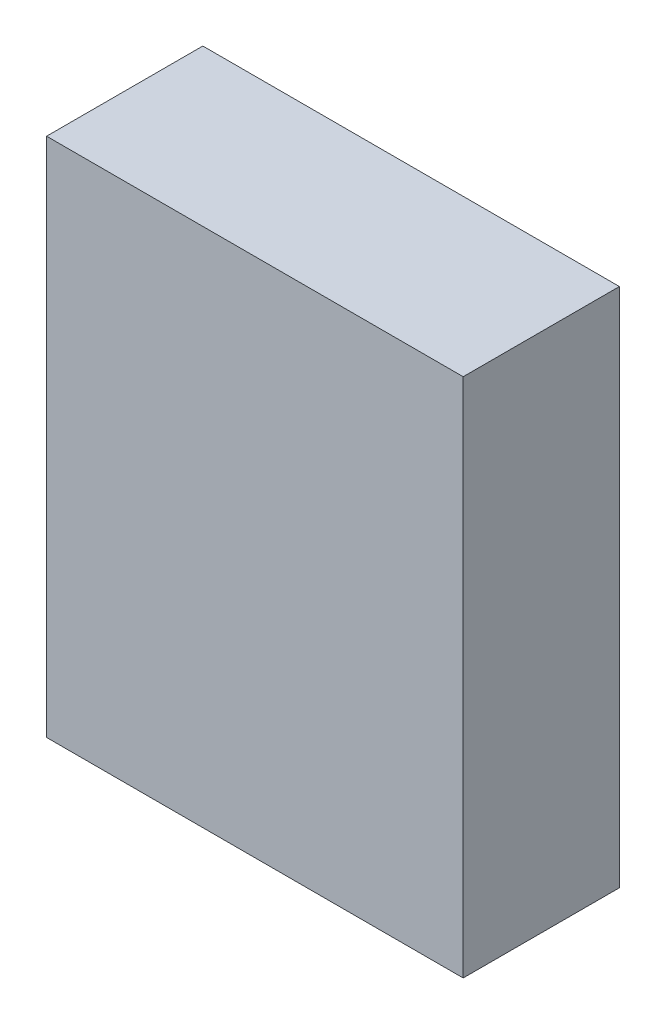
ISO-10303-21;
HEADER;
FILE_DESCRIPTION(('STEP AP214'),'2;1');
FILE_NAME('part.step','',(''),(''),'','','');
FILE_SCHEMA(('AUTOMOTIVE_DESIGN { 1 0 10303 214 1 1 1 1 }'));
ENDSEC;
DATA;
#1=APPLICATION_CONTEXT('core data for automotive mechanical design processes');
#2=APPLICATION_PROTOCOL_DEFINITION('international standard','automotive_design',2000,#1);
#3=PRODUCT_CONTEXT('',#1,'mechanical');
#4=PRODUCT('Part','Part','',(#3));
#5=PRODUCT_RELATED_PRODUCT_CATEGORY('part','',(#4));
#6=PRODUCT_DEFINITION_FORMATION('','',#4);
#7=PRODUCT_DEFINITION_CONTEXT('part definition',#1,'design');
#8=PRODUCT_DEFINITION('design','',#6,#7);
#9=PRODUCT_DEFINITION_SHAPE('','',#8);
#10=(LENGTH_UNIT() NAMED_UNIT(*) SI_UNIT(.MILLI.,.METRE.));
#11=(NAMED_UNIT(*) PLANE_ANGLE_UNIT() SI_UNIT($,.RADIAN.));
#12=(NAMED_UNIT(*) SI_UNIT($,.STERADIAN.) SOLID_ANGLE_UNIT());
#13=UNCERTAINTY_MEASURE_WITH_UNIT(LENGTH_MEASURE(1.E-05),#10,'distance_accuracy_value','');
#14=(GEOMETRIC_REPRESENTATION_CONTEXT(3) GLOBAL_UNCERTAINTY_ASSIGNED_CONTEXT((#13)) GLOBAL_UNIT_ASSIGNED_CONTEXT((#10,
#11,#12)) REPRESENTATION_CONTEXT('',''));
#15=CARTESIAN_POINT('',(0.,0.,0.));
#16=DIRECTION('',(0.,0.,1.));
#17=DIRECTION('',(1.,0.,0.));
#18=AXIS2_PLACEMENT_3D('',#15,#16,#17);
#19=CARTESIAN_POINT('',(-75.6361607142857,48.0133928571429,30.));
#20=DIRECTION('',(1.,0.,0.));
#21=DIRECTION('',(0.,1.,0.));
#22=AXIS2_PLACEMENT_3D('',#19,#20,#21);
#23=PLANE('',#22);
#24=DIRECTION('',(0.,-1.,0.));
#25=VECTOR('',#24,1.);
#26=CARTESIAN_POINT('',(-75.6361607142857,48.0133928571429,0.));
#27=LINE('',#26,#25);
#28=CARTESIAN_POINT('',(-75.6361607142857,48.0133928571429,0.));
#29=VERTEX_POINT('',#28);
#30=CARTESIAN_POINT('',(-75.6361607142857,-51.9866071428571,0.));
#31=VERTEX_POINT('',#30);
#32=EDGE_CURVE('E96',#29,#31,#27,.T.);
#33=ORIENTED_EDGE('',*,*,#32,.T.);
#34=DIRECTION('',(0.,0.,-1.));
#35=VECTOR('',#34,1.);
#36=CARTESIAN_POINT('',(-75.6361607142857,-51.9866071428571,30.));
#37=LINE('',#36,#35);
#38=CARTESIAN_POINT('',(-75.6361607142857,-51.9866071428571,30.));
#39=VERTEX_POINT('',#38);
#40=EDGE_CURVE('E11',#39,#31,#37,.T.);
#41=ORIENTED_EDGE('',*,*,#40,.F.);
#42=DIRECTION('',(0.,-1.,0.));
#43=VECTOR('',#42,1.);
#44=CARTESIAN_POINT('',(-75.6361607142857,48.0133928571429,30.));
#45=LINE('',#44,#43);
#46=CARTESIAN_POINT('',(-75.6361607142857,48.0133928571429,30.));
#47=VERTEX_POINT('',#46);
#48=EDGE_CURVE('E84',#47,#39,#45,.T.);
#49=ORIENTED_EDGE('',*,*,#48,.F.);
#50=DIRECTION('',(0.,0.,-1.));
#51=VECTOR('',#50,1.);
#52=CARTESIAN_POINT('',(-75.6361607142857,48.0133928571429,30.));
#53=LINE('',#52,#51);
#54=EDGE_CURVE('E92',#47,#29,#53,.T.);
#55=ORIENTED_EDGE('',*,*,#54,.T.);
#56=EDGE_LOOP('',(#33,#41,#49,#55));
#57=FACE_BOUND('',#56,.T.);
#58=ADVANCED_FACE('F33',(#57),#23,.F.);
#59=CARTESIAN_POINT('',(-75.6361607142857,-51.9866071428571,30.));
#60=DIRECTION('',(0.,1.,0.));
#61=DIRECTION('',(0.,0.,1.));
#62=AXIS2_PLACEMENT_3D('',#59,#60,#61);
#63=PLANE('',#62);
#64=DIRECTION('',(1.,0.,0.));
#65=VECTOR('',#64,1.);
#66=CARTESIAN_POINT('',(-75.6361607142857,-51.9866071428571,0.));
#67=LINE('',#66,#65);
#68=CARTESIAN_POINT('',(4.36383928571429,-51.9866071428571,0.));
#69=VERTEX_POINT('',#68);
#70=EDGE_CURVE('E88',#31,#69,#67,.T.);
#71=ORIENTED_EDGE('',*,*,#70,.T.);
#72=DIRECTION('',(0.,0.,-1.));
#73=VECTOR('',#72,1.);
#74=CARTESIAN_POINT('',(4.36383928571429,-51.9866071428571,30.));
#75=LINE('',#74,#73);
#76=CARTESIAN_POINT('',(4.36383928571429,-51.9866071428571,30.));
#77=VERTEX_POINT('',#76);
#78=EDGE_CURVE('E41',#77,#69,#75,.T.);
#79=ORIENTED_EDGE('',*,*,#78,.F.);
#80=DIRECTION('',(1.,0.,0.));
#81=VECTOR('',#80,1.);
#82=CARTESIAN_POINT('',(-75.6361607142857,-51.9866071428571,30.));
#83=LINE('',#82,#81);
#84=EDGE_CURVE('E79',#39,#77,#83,.T.);
#85=ORIENTED_EDGE('',*,*,#84,.F.);
#86=ORIENTED_EDGE('',*,*,#40,.T.);
#87=EDGE_LOOP('',(#71,#79,#85,#86));
#88=FACE_BOUND('',#87,.T.);
#89=ADVANCED_FACE('F87',(#88),#63,.F.);
#90=CARTESIAN_POINT('',(4.36383928571428,48.0133928571429,30.));
#91=DIRECTION('',(-1.,0.,0.));
#92=DIRECTION('',(0.,-1.,0.));
#93=AXIS2_PLACEMENT_3D('',#90,#91,#92);
#94=PLANE('',#93);
#95=DIRECTION('',(0.,1.,0.));
#96=VECTOR('',#95,1.);
#97=CARTESIAN_POINT('',(4.36383928571428,48.0133928571429,0.));
#98=LINE('',#97,#96);
#99=CARTESIAN_POINT('',(4.36383928571428,48.0133928571429,0.));
#100=VERTEX_POINT('',#99);
#101=EDGE_CURVE('E66',#69,#100,#98,.T.);
#102=ORIENTED_EDGE('',*,*,#101,.T.);
#103=DIRECTION('',(0.,0.,-1.));
#104=VECTOR('',#103,1.);
#105=CARTESIAN_POINT('',(4.36383928571428,48.0133928571429,30.));
#106=LINE('',#105,#104);
#107=CARTESIAN_POINT('',(4.36383928571428,48.0133928571429,30.));
#108=VERTEX_POINT('',#107);
#109=EDGE_CURVE('E89',#108,#100,#106,.T.);
#110=ORIENTED_EDGE('',*,*,#109,.F.);
#111=DIRECTION('',(0.,1.,0.));
#112=VECTOR('',#111,1.);
#113=CARTESIAN_POINT('',(4.36383928571428,48.0133928571429,30.));
#114=LINE('',#113,#112);
#115=EDGE_CURVE('E82',#77,#108,#114,.T.);
#116=ORIENTED_EDGE('',*,*,#115,.F.);
#117=ORIENTED_EDGE('',*,*,#78,.T.);
#118=EDGE_LOOP('',(#102,#110,#116,#117));
#119=FACE_BOUND('',#118,.T.);
#120=ADVANCED_FACE('F90',(#119),#94,.F.);
#121=CARTESIAN_POINT('',(-75.6361607142857,48.0133928571429,30.));
#122=DIRECTION('',(0.,-1.,0.));
#123=DIRECTION('',(0.,0.,-1.));
#124=AXIS2_PLACEMENT_3D('',#121,#122,#123);
#125=PLANE('',#124);
#126=DIRECTION('',(-1.,0.,0.));
#127=VECTOR('',#126,1.);
#128=CARTESIAN_POINT('',(-75.6361607142857,48.0133928571429,0.));
#129=LINE('',#128,#127);
#130=EDGE_CURVE('E72',#100,#29,#129,.T.);
#131=ORIENTED_EDGE('',*,*,#130,.T.);
#132=ORIENTED_EDGE('',*,*,#54,.F.);
#133=DIRECTION('',(-1.,0.,0.));
#134=VECTOR('',#133,1.);
#135=CARTESIAN_POINT('',(-75.6361607142857,48.0133928571429,30.));
#136=LINE('',#135,#134);
#137=EDGE_CURVE('E49',#108,#47,#136,.T.);
#138=ORIENTED_EDGE('',*,*,#137,.F.);
#139=ORIENTED_EDGE('',*,*,#109,.T.);
#140=EDGE_LOOP('',(#131,#132,#138,#139));
#141=FACE_BOUND('',#140,.T.);
#142=ADVANCED_FACE('F103',(#141),#125,.F.);
#143=CARTESIAN_POINT('',(0.,0.,30.));
#144=DIRECTION('',(0.,0.,1.));
#145=DIRECTION('',(1.,0.,0.));
#146=AXIS2_PLACEMENT_3D('',#143,#144,#145);
#147=PLANE('',#146);
#148=ORIENTED_EDGE('',*,*,#48,.T.);
#149=ORIENTED_EDGE('',*,*,#84,.T.);
#150=ORIENTED_EDGE('',*,*,#115,.T.);
#151=ORIENTED_EDGE('',*,*,#137,.T.);
#152=EDGE_LOOP('',(#148,#149,#150,#151));
#153=FACE_BOUND('',#152,.T.);
#154=ADVANCED_FACE('F80',(#153),#147,.T.);
#155=CARTESIAN_POINT('',(0.,0.,0.));
#156=DIRECTION('',(0.,0.,1.));
#157=DIRECTION('',(1.,0.,0.));
#158=AXIS2_PLACEMENT_3D('',#155,#156,#157);
#159=PLANE('',#158);
#160=ORIENTED_EDGE('',*,*,#32,.F.);
#161=ORIENTED_EDGE('',*,*,#130,.F.);
#162=ORIENTED_EDGE('',*,*,#101,.F.);
#163=ORIENTED_EDGE('',*,*,#70,.F.);
#164=EDGE_LOOP('',(#160,#161,#162,#163));
#165=FACE_BOUND('',#164,.T.);
#166=ADVANCED_FACE('F106',(#165),#159,.F.);
#167=CLOSED_SHELL('',(#58,#89,#120,#142,#154,#166));
#168=MANIFOLD_SOLID_BREP('B2',#167);
#169=ADVANCED_BREP_SHAPE_REPRESENTATION('',(#18,#168),#14);
#170=SHAPE_DEFINITION_REPRESENTATION(#9,#169);
ENDSEC;
END-ISO-10303-21;
